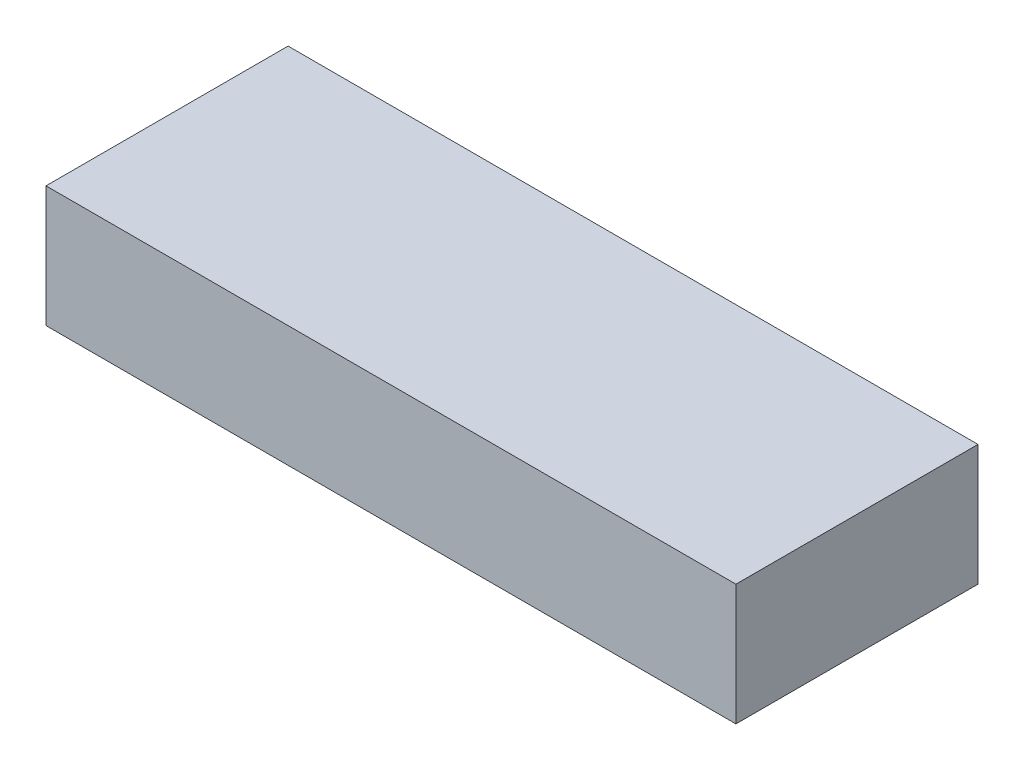
ISO-10303-21;
HEADER;
FILE_DESCRIPTION(('STEP AP214'),'2;1');
FILE_NAME('part.step','',(''),(''),'','','');
FILE_SCHEMA(('AUTOMOTIVE_DESIGN { 1 0 10303 214 1 1 1 1 }'));
ENDSEC;
DATA;
#1=APPLICATION_CONTEXT('core data for automotive mechanical design processes');
#2=APPLICATION_PROTOCOL_DEFINITION('international standard','automotive_design',2000,#1);
#3=PRODUCT_CONTEXT('',#1,'mechanical');
#4=PRODUCT('Part','Part','',(#3));
#5=PRODUCT_RELATED_PRODUCT_CATEGORY('part','',(#4));
#6=PRODUCT_DEFINITION_FORMATION('','',#4);
#7=PRODUCT_DEFINITION_CONTEXT('part definition',#1,'design');
#8=PRODUCT_DEFINITION('design','',#6,#7);
#9=PRODUCT_DEFINITION_SHAPE('','',#8);
#10=(LENGTH_UNIT() NAMED_UNIT(*) SI_UNIT(.MILLI.,.METRE.));
#11=(NAMED_UNIT(*) PLANE_ANGLE_UNIT() SI_UNIT($,.RADIAN.));
#12=(NAMED_UNIT(*) SI_UNIT($,.STERADIAN.) SOLID_ANGLE_UNIT());
#13=UNCERTAINTY_MEASURE_WITH_UNIT(LENGTH_MEASURE(1.E-05),#10,'distance_accuracy_value','');
#14=(GEOMETRIC_REPRESENTATION_CONTEXT(3) GLOBAL_UNCERTAINTY_ASSIGNED_CONTEXT((#13)) GLOBAL_UNIT_ASSIGNED_CONTEXT((#10,
#11,#12)) REPRESENTATION_CONTEXT('',''));
#15=CARTESIAN_POINT('',(0.,0.,0.));
#16=DIRECTION('',(0.,0.,1.));
#17=DIRECTION('',(1.,0.,0.));
#18=AXIS2_PLACEMENT_3D('',#15,#16,#17);
#19=CARTESIAN_POINT('',(0.,-10.,0.));
#20=DIRECTION('',(-1.,0.,0.));
#21=DIRECTION('',(0.,0.,1.));
#22=AXIS2_PLACEMENT_3D('',#19,#20,#21);
#23=PLANE('',#22);
#24=DIRECTION('',(0.,0.,1.));
#25=VECTOR('',#24,1.);
#26=CARTESIAN_POINT('',(0.,0.,0.));
#27=LINE('',#26,#25);
#28=CARTESIAN_POINT('',(0.,0.,-20.));
#29=VERTEX_POINT('',#28);
#30=CARTESIAN_POINT('',(0.,0.,0.));
#31=VERTEX_POINT('',#30);
#32=EDGE_CURVE('E104',#29,#31,#27,.T.);
#33=ORIENTED_EDGE('',*,*,#32,.F.);
#34=DIRECTION('',(0.,1.,0.));
#35=VECTOR('',#34,1.);
#36=CARTESIAN_POINT('',(0.,-10.,-20.));
#37=LINE('',#36,#35);
#38=CARTESIAN_POINT('',(0.,-10.,-20.));
#39=VERTEX_POINT('',#38);
#40=EDGE_CURVE('E11',#39,#29,#37,.T.);
#41=ORIENTED_EDGE('',*,*,#40,.F.);
#42=DIRECTION('',(0.,0.,1.));
#43=VECTOR('',#42,1.);
#44=CARTESIAN_POINT('',(0.,-10.,0.));
#45=LINE('',#44,#43);
#46=CARTESIAN_POINT('',(0.,-10.,0.));
#47=VERTEX_POINT('',#46);
#48=EDGE_CURVE('E100',#39,#47,#45,.T.);
#49=ORIENTED_EDGE('',*,*,#48,.T.);
#50=DIRECTION('',(0.,1.,0.));
#51=VECTOR('',#50,1.);
#52=CARTESIAN_POINT('',(0.,-10.,0.));
#53=LINE('',#52,#51);
#54=EDGE_CURVE('E45',#47,#31,#53,.T.);
#55=ORIENTED_EDGE('',*,*,#54,.T.);
#56=EDGE_LOOP('',(#33,#41,#49,#55));
#57=FACE_BOUND('',#56,.T.);
#58=ADVANCED_FACE('F39',(#57),#23,.T.);
#59=CARTESIAN_POINT('',(0.,-10.,-20.));
#60=DIRECTION('',(0.,0.,-1.));
#61=DIRECTION('',(-1.,0.,0.));
#62=AXIS2_PLACEMENT_3D('',#59,#60,#61);
#63=PLANE('',#62);
#64=DIRECTION('',(-1.,0.,0.));
#65=VECTOR('',#64,1.);
#66=CARTESIAN_POINT('',(0.,0.,-20.));
#67=LINE('',#66,#65);
#68=CARTESIAN_POINT('',(57.,0.,-20.));
#69=VERTEX_POINT('',#68);
#70=EDGE_CURVE('E98',#69,#29,#67,.T.);
#71=ORIENTED_EDGE('',*,*,#70,.F.);
#72=DIRECTION('',(0.,1.,0.));
#73=VECTOR('',#72,1.);
#74=CARTESIAN_POINT('',(57.,-10.,-20.));
#75=LINE('',#74,#73);
#76=CARTESIAN_POINT('',(57.,-10.,-20.));
#77=VERTEX_POINT('',#76);
#78=EDGE_CURVE('E48',#77,#69,#75,.T.);
#79=ORIENTED_EDGE('',*,*,#78,.F.);
#80=DIRECTION('',(-1.,0.,0.));
#81=VECTOR('',#80,1.);
#82=CARTESIAN_POINT('',(0.,-10.,-20.));
#83=LINE('',#82,#81);
#84=EDGE_CURVE('E92',#77,#39,#83,.T.);
#85=ORIENTED_EDGE('',*,*,#84,.T.);
#86=ORIENTED_EDGE('',*,*,#40,.T.);
#87=EDGE_LOOP('',(#71,#79,#85,#86));
#88=FACE_BOUND('',#87,.T.);
#89=ADVANCED_FACE('F111',(#88),#63,.T.);
#90=CARTESIAN_POINT('',(57.,-10.,0.));
#91=DIRECTION('',(1.,0.,0.));
#92=DIRECTION('',(0.,0.,-1.));
#93=AXIS2_PLACEMENT_3D('',#90,#91,#92);
#94=PLANE('',#93);
#95=DIRECTION('',(0.,0.,-1.));
#96=VECTOR('',#95,1.);
#97=CARTESIAN_POINT('',(57.,0.,0.));
#98=LINE('',#97,#96);
#99=CARTESIAN_POINT('',(57.,0.,0.));
#100=VERTEX_POINT('',#99);
#101=EDGE_CURVE('E87',#100,#69,#98,.T.);
#102=ORIENTED_EDGE('',*,*,#101,.F.);
#103=DIRECTION('',(0.,1.,0.));
#104=VECTOR('',#103,1.);
#105=CARTESIAN_POINT('',(57.,-10.,0.));
#106=LINE('',#105,#104);
#107=CARTESIAN_POINT('',(57.,-10.,0.));
#108=VERTEX_POINT('',#107);
#109=EDGE_CURVE('E84',#108,#100,#106,.T.);
#110=ORIENTED_EDGE('',*,*,#109,.F.);
#111=DIRECTION('',(0.,0.,-1.));
#112=VECTOR('',#111,1.);
#113=CARTESIAN_POINT('',(57.,-10.,0.));
#114=LINE('',#113,#112);
#115=EDGE_CURVE('E90',#108,#77,#114,.T.);
#116=ORIENTED_EDGE('',*,*,#115,.T.);
#117=ORIENTED_EDGE('',*,*,#78,.T.);
#118=EDGE_LOOP('',(#102,#110,#116,#117));
#119=FACE_BOUND('',#118,.T.);
#120=ADVANCED_FACE('F86',(#119),#94,.T.);
#121=CARTESIAN_POINT('',(0.,-10.,0.));
#122=DIRECTION('',(0.,0.,1.));
#123=DIRECTION('',(1.,0.,0.));
#124=AXIS2_PLACEMENT_3D('',#121,#122,#123);
#125=PLANE('',#124);
#126=DIRECTION('',(1.,0.,0.));
#127=VECTOR('',#126,1.);
#128=CARTESIAN_POINT('',(0.,0.,0.));
#129=LINE('',#128,#127);
#130=EDGE_CURVE('E106',#31,#100,#129,.T.);
#131=ORIENTED_EDGE('',*,*,#130,.F.);
#132=ORIENTED_EDGE('',*,*,#54,.F.);
#133=DIRECTION('',(1.,0.,0.));
#134=VECTOR('',#133,1.);
#135=CARTESIAN_POINT('',(0.,-10.,0.));
#136=LINE('',#135,#134);
#137=EDGE_CURVE('E93',#47,#108,#136,.T.);
#138=ORIENTED_EDGE('',*,*,#137,.T.);
#139=ORIENTED_EDGE('',*,*,#109,.T.);
#140=EDGE_LOOP('',(#131,#132,#138,#139));
#141=FACE_BOUND('',#140,.T.);
#142=ADVANCED_FACE('F96',(#141),#125,.T.);
#143=CARTESIAN_POINT('',(0.,-10.,0.));
#144=DIRECTION('',(0.,-1.,0.));
#145=DIRECTION('',(0.,0.,-1.));
#146=AXIS2_PLACEMENT_3D('',#143,#144,#145);
#147=PLANE('',#146);
#148=ORIENTED_EDGE('',*,*,#48,.F.);
#149=ORIENTED_EDGE('',*,*,#84,.F.);
#150=ORIENTED_EDGE('',*,*,#115,.F.);
#151=ORIENTED_EDGE('',*,*,#137,.F.);
#152=EDGE_LOOP('',(#148,#149,#150,#151));
#153=FACE_BOUND('',#152,.T.);
#154=ADVANCED_FACE('F95',(#153),#147,.T.);
#155=CARTESIAN_POINT('',(0.,0.,0.));
#156=DIRECTION('',(0.,-1.,0.));
#157=DIRECTION('',(0.,0.,-1.));
#158=AXIS2_PLACEMENT_3D('',#155,#156,#157);
#159=PLANE('',#158);
#160=ORIENTED_EDGE('',*,*,#32,.T.);
#161=ORIENTED_EDGE('',*,*,#130,.T.);
#162=ORIENTED_EDGE('',*,*,#101,.T.);
#163=ORIENTED_EDGE('',*,*,#70,.T.);
#164=EDGE_LOOP('',(#160,#161,#162,#163));
#165=FACE_BOUND('',#164,.T.);
#166=ADVANCED_FACE('F115',(#165),#159,.F.);
#167=CLOSED_SHELL('',(#58,#89,#120,#142,#154,#166));
#168=MANIFOLD_SOLID_BREP('B2',#167);
#169=ADVANCED_BREP_SHAPE_REPRESENTATION('',(#18,#168),#14);
#170=SHAPE_DEFINITION_REPRESENTATION(#9,#169);
ENDSEC;
END-ISO-10303-21;
